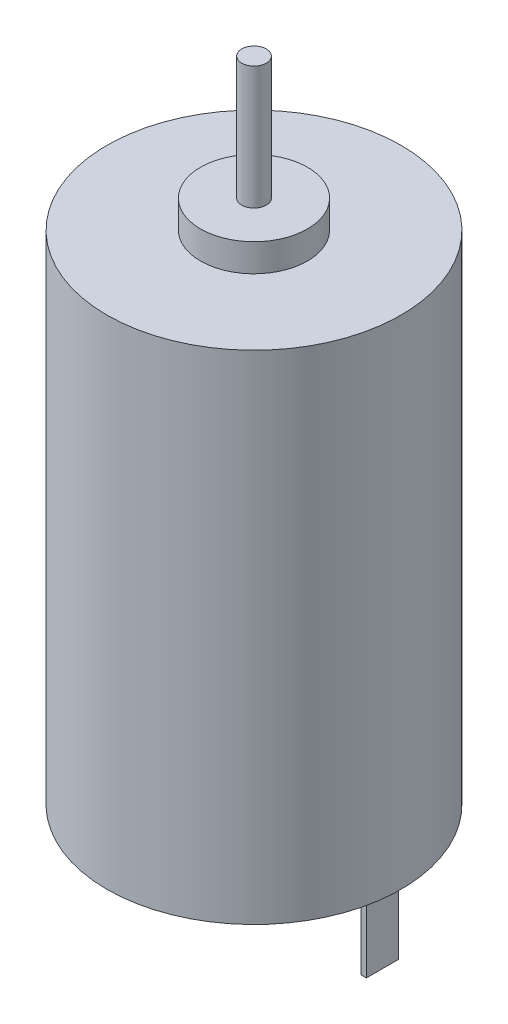
ISO-10303-21;
HEADER;
FILE_DESCRIPTION(('STEP AP214'),'2;1');
FILE_NAME('part.step','',(''),(''),'','','');
FILE_SCHEMA(('AUTOMOTIVE_DESIGN { 1 0 10303 214 1 1 1 1 }'));
ENDSEC;
DATA;
#1=APPLICATION_CONTEXT('core data for automotive mechanical design processes');
#2=APPLICATION_PROTOCOL_DEFINITION('international standard','automotive_design',2000,#1);
#3=PRODUCT_CONTEXT('',#1,'mechanical');
#4=PRODUCT('Part','Part','',(#3));
#5=PRODUCT_RELATED_PRODUCT_CATEGORY('part','',(#4));
#6=PRODUCT_DEFINITION_FORMATION('','',#4);
#7=PRODUCT_DEFINITION_CONTEXT('part definition',#1,'design');
#8=PRODUCT_DEFINITION('design','',#6,#7);
#9=PRODUCT_DEFINITION_SHAPE('','',#8);
#10=(LENGTH_UNIT() NAMED_UNIT(*) SI_UNIT(.MILLI.,.METRE.));
#11=(NAMED_UNIT(*) PLANE_ANGLE_UNIT() SI_UNIT($,.RADIAN.));
#12=(NAMED_UNIT(*) SI_UNIT($,.STERADIAN.) SOLID_ANGLE_UNIT());
#13=UNCERTAINTY_MEASURE_WITH_UNIT(LENGTH_MEASURE(1.E-05),#10,'distance_accuracy_value','');
#14=(GEOMETRIC_REPRESENTATION_CONTEXT(3) GLOBAL_UNCERTAINTY_ASSIGNED_CONTEXT((#13)) GLOBAL_UNIT_ASSIGNED_CONTEXT((#10,
#11,#12)) REPRESENTATION_CONTEXT('',''));
#15=CARTESIAN_POINT('',(0.,0.,0.));
#16=DIRECTION('',(0.,0.,1.));
#17=DIRECTION('',(1.,0.,0.));
#18=AXIS2_PLACEMENT_3D('',#15,#16,#17);
#19=CARTESIAN_POINT('',(0.,60.6,0.));
#20=DIRECTION('',(0.,-1.,0.));
#21=DIRECTION('',(0.,0.,-1.));
#22=AXIS2_PLACEMENT_3D('',#19,#20,#21);
#23=CYLINDRICAL_SURFACE('',#22,1.15);
#24=CARTESIAN_POINT('',(0.,60.6,0.));
#25=DIRECTION('',(0.,1.,0.));
#26=DIRECTION('',(0.,0.,1.));
#27=AXIS2_PLACEMENT_3D('',#24,#25,#26);
#28=CIRCLE('',#27,1.15);
#29=CARTESIAN_POINT('',(0.,60.6,1.15));
#30=VERTEX_POINT('',#29);
#31=EDGE_CURVE('E11',#30,#30,#28,.T.);
#32=ORIENTED_EDGE('',*,*,#31,.F.);
#33=EDGE_LOOP('',(#32));
#34=FACE_BOUND('',#33,.T.);
#35=CARTESIAN_POINT('',(0.,49.1,0.));
#36=DIRECTION('',(0.,1.,0.));
#37=DIRECTION('',(0.,0.,1.));
#38=AXIS2_PLACEMENT_3D('',#35,#36,#37);
#39=CIRCLE('',#38,1.15);
#40=CARTESIAN_POINT('',(0.,49.1,1.15));
#41=VERTEX_POINT('',#40);
#42=EDGE_CURVE('E53',#41,#41,#39,.T.);
#43=ORIENTED_EDGE('',*,*,#42,.T.);
#44=EDGE_LOOP('',(#43));
#45=FACE_BOUND('',#44,.T.);
#46=ADVANCED_FACE('F50',(#34,#45),#23,.T.);
#47=CARTESIAN_POINT('',(0.,60.6,0.));
#48=DIRECTION('',(0.,1.,0.));
#49=DIRECTION('',(0.,0.,1.));
#50=AXIS2_PLACEMENT_3D('',#47,#48,#49);
#51=PLANE('',#50);
#52=ORIENTED_EDGE('',*,*,#31,.T.);
#53=EDGE_LOOP('',(#52));
#54=FACE_BOUND('',#53,.T.);
#55=ADVANCED_FACE('F65',(#54),#51,.T.);
#56=CARTESIAN_POINT('',(0.,49.1,0.));
#57=DIRECTION('',(0.,1.,0.));
#58=DIRECTION('',(0.,0.,1.));
#59=AXIS2_PLACEMENT_3D('',#56,#57,#58);
#60=PLANE('',#59);
#61=ORIENTED_EDGE('',*,*,#42,.F.);
#62=EDGE_LOOP('',(#61));
#63=FACE_BOUND('',#62,.T.);
#64=ADVANCED_FACE('F63',(#63),#60,.F.);
#65=CLOSED_SHELL('',(#46,#55,#64));
#66=MANIFOLD_SOLID_BREP('B2',#65);
#67=CARTESIAN_POINT('',(12.,-7.3,1.5));
#68=DIRECTION('',(-1.,0.,0.));
#69=DIRECTION('',(0.,0.,1.));
#70=AXIS2_PLACEMENT_3D('',#67,#68,#69);
#71=PLANE('',#70);
#72=DIRECTION('',(0.,0.,1.));
#73=VECTOR('',#72,1.);
#74=CARTESIAN_POINT('',(12.,0.,1.5));
#75=LINE('',#74,#73);
#76=CARTESIAN_POINT('',(12.,0.,-1.5));
#77=VERTEX_POINT('',#76);
#78=CARTESIAN_POINT('',(12.,0.,1.5));
#79=VERTEX_POINT('',#78);
#80=EDGE_CURVE('E164',#77,#79,#75,.T.);
#81=ORIENTED_EDGE('',*,*,#80,.T.);
#82=DIRECTION('',(0.,1.,0.));
#83=VECTOR('',#82,1.);
#84=CARTESIAN_POINT('',(12.,-7.3,1.5));
#85=LINE('',#84,#83);
#86=CARTESIAN_POINT('',(12.,-7.3,1.5));
#87=VERTEX_POINT('',#86);
#88=EDGE_CURVE('E48',#87,#79,#85,.T.);
#89=ORIENTED_EDGE('',*,*,#88,.F.);
#90=DIRECTION('',(0.,0.,1.));
#91=VECTOR('',#90,1.);
#92=CARTESIAN_POINT('',(12.,-7.3,1.5));
#93=LINE('',#92,#91);
#94=CARTESIAN_POINT('',(12.,-7.3,-1.5));
#95=VERTEX_POINT('',#94);
#96=EDGE_CURVE('E152',#95,#87,#93,.T.);
#97=ORIENTED_EDGE('',*,*,#96,.F.);
#98=DIRECTION('',(0.,1.,0.));
#99=VECTOR('',#98,1.);
#100=CARTESIAN_POINT('',(12.,-7.3,-1.5));
#101=LINE('',#100,#99);
#102=EDGE_CURVE('E160',#95,#77,#101,.T.);
#103=ORIENTED_EDGE('',*,*,#102,.T.);
#104=EDGE_LOOP('',(#81,#89,#97,#103));
#105=FACE_BOUND('',#104,.T.);
#106=ADVANCED_FACE('F101',(#105),#71,.F.);
#107=CARTESIAN_POINT('',(12.,-7.3,1.5));
#108=DIRECTION('',(0.,0.,-1.));
#109=DIRECTION('',(-1.,0.,0.));
#110=AXIS2_PLACEMENT_3D('',#107,#108,#109);
#111=PLANE('',#110);
#112=DIRECTION('',(-1.,0.,0.));
#113=VECTOR('',#112,1.);
#114=CARTESIAN_POINT('',(12.,0.,1.5));
#115=LINE('',#114,#113);
#116=CARTESIAN_POINT('',(11.5,0.,1.5));
#117=VERTEX_POINT('',#116);
#118=EDGE_CURVE('E156',#79,#117,#115,.T.);
#119=ORIENTED_EDGE('',*,*,#118,.T.);
#120=DIRECTION('',(0.,1.,0.));
#121=VECTOR('',#120,1.);
#122=CARTESIAN_POINT('',(11.5,-7.3,1.5));
#123=LINE('',#122,#121);
#124=CARTESIAN_POINT('',(11.5,-7.3,1.5));
#125=VERTEX_POINT('',#124);
#126=EDGE_CURVE('E109',#125,#117,#123,.T.);
#127=ORIENTED_EDGE('',*,*,#126,.F.);
#128=DIRECTION('',(-1.,0.,0.));
#129=VECTOR('',#128,1.);
#130=CARTESIAN_POINT('',(12.,-7.3,1.5));
#131=LINE('',#130,#129);
#132=EDGE_CURVE('E147',#87,#125,#131,.T.);
#133=ORIENTED_EDGE('',*,*,#132,.F.);
#134=ORIENTED_EDGE('',*,*,#88,.T.);
#135=EDGE_LOOP('',(#119,#127,#133,#134));
#136=FACE_BOUND('',#135,.T.);
#137=ADVANCED_FACE('F155',(#136),#111,.F.);
#138=CARTESIAN_POINT('',(11.5,-7.3,1.5));
#139=DIRECTION('',(1.,0.,0.));
#140=DIRECTION('',(0.,0.,-1.));
#141=AXIS2_PLACEMENT_3D('',#138,#139,#140);
#142=PLANE('',#141);
#143=DIRECTION('',(0.,0.,-1.));
#144=VECTOR('',#143,1.);
#145=CARTESIAN_POINT('',(11.5,0.,1.5));
#146=LINE('',#145,#144);
#147=CARTESIAN_POINT('',(11.5,0.,-1.5));
#148=VERTEX_POINT('',#147);
#149=EDGE_CURVE('E134',#117,#148,#146,.T.);
#150=ORIENTED_EDGE('',*,*,#149,.T.);
#151=DIRECTION('',(0.,1.,0.));
#152=VECTOR('',#151,1.);
#153=CARTESIAN_POINT('',(11.5,-7.3,-1.5));
#154=LINE('',#153,#152);
#155=CARTESIAN_POINT('',(11.5,-7.3,-1.5));
#156=VERTEX_POINT('',#155);
#157=EDGE_CURVE('E157',#156,#148,#154,.T.);
#158=ORIENTED_EDGE('',*,*,#157,.F.);
#159=DIRECTION('',(0.,0.,-1.));
#160=VECTOR('',#159,1.);
#161=CARTESIAN_POINT('',(11.5,-7.3,1.5));
#162=LINE('',#161,#160);
#163=EDGE_CURVE('E150',#125,#156,#162,.T.);
#164=ORIENTED_EDGE('',*,*,#163,.F.);
#165=ORIENTED_EDGE('',*,*,#126,.T.);
#166=EDGE_LOOP('',(#150,#158,#164,#165));
#167=FACE_BOUND('',#166,.T.);
#168=ADVANCED_FACE('F158',(#167),#142,.F.);
#169=CARTESIAN_POINT('',(12.,-7.3,-1.5));
#170=DIRECTION('',(0.,0.,1.));
#171=DIRECTION('',(1.,0.,0.));
#172=AXIS2_PLACEMENT_3D('',#169,#170,#171);
#173=PLANE('',#172);
#174=DIRECTION('',(1.,0.,0.));
#175=VECTOR('',#174,1.);
#176=CARTESIAN_POINT('',(12.,0.,-1.5));
#177=LINE('',#176,#175);
#178=EDGE_CURVE('E140',#148,#77,#177,.T.);
#179=ORIENTED_EDGE('',*,*,#178,.T.);
#180=ORIENTED_EDGE('',*,*,#102,.F.);
#181=DIRECTION('',(1.,0.,0.));
#182=VECTOR('',#181,1.);
#183=CARTESIAN_POINT('',(12.,-7.3,-1.5));
#184=LINE('',#183,#182);
#185=EDGE_CURVE('E117',#156,#95,#184,.T.);
#186=ORIENTED_EDGE('',*,*,#185,.F.);
#187=ORIENTED_EDGE('',*,*,#157,.T.);
#188=EDGE_LOOP('',(#179,#180,#186,#187));
#189=FACE_BOUND('',#188,.T.);
#190=ADVANCED_FACE('F171',(#189),#173,.F.);
#191=CARTESIAN_POINT('',(0.,-7.3,0.));
#192=DIRECTION('',(0.,1.,0.));
#193=DIRECTION('',(0.,0.,1.));
#194=AXIS2_PLACEMENT_3D('',#191,#192,#193);
#195=PLANE('',#194);
#196=ORIENTED_EDGE('',*,*,#96,.T.);
#197=ORIENTED_EDGE('',*,*,#132,.T.);
#198=ORIENTED_EDGE('',*,*,#163,.T.);
#199=ORIENTED_EDGE('',*,*,#185,.T.);
#200=EDGE_LOOP('',(#196,#197,#198,#199));
#201=FACE_BOUND('',#200,.T.);
#202=ADVANCED_FACE('F148',(#201),#195,.F.);
#203=CARTESIAN_POINT('',(0.,0.,0.));
#204=DIRECTION('',(0.,1.,0.));
#205=DIRECTION('',(0.,0.,1.));
#206=AXIS2_PLACEMENT_3D('',#203,#204,#205);
#207=PLANE('',#206);
#208=ORIENTED_EDGE('',*,*,#80,.F.);
#209=ORIENTED_EDGE('',*,*,#178,.F.);
#210=ORIENTED_EDGE('',*,*,#149,.F.);
#211=ORIENTED_EDGE('',*,*,#118,.F.);
#212=EDGE_LOOP('',(#208,#209,#210,#211));
#213=FACE_BOUND('',#212,.T.);
#214=ADVANCED_FACE('F174',(#213),#207,.T.);
#215=CLOSED_SHELL('',(#106,#137,#168,#190,#202,#214));
#216=MANIFOLD_SOLID_BREP('B6',#215);
#217=CARTESIAN_POINT('',(-12.,-7.3,1.5));
#218=DIRECTION('',(1.,0.,0.));
#219=DIRECTION('',(0.,0.,-1.));
#220=AXIS2_PLACEMENT_3D('',#217,#218,#219);
#221=PLANE('',#220);
#222=DIRECTION('',(0.,0.,-1.));
#223=VECTOR('',#222,1.);
#224=CARTESIAN_POINT('',(-12.,0.,1.5));
#225=LINE('',#224,#223);
#226=CARTESIAN_POINT('',(-12.,0.,1.5));
#227=VERTEX_POINT('',#226);
#228=CARTESIAN_POINT('',(-12.,0.,-1.5));
#229=VERTEX_POINT('',#228);
#230=EDGE_CURVE('E295',#227,#229,#225,.T.);
#231=ORIENTED_EDGE('',*,*,#230,.T.);
#232=DIRECTION('',(0.,1.,0.));
#233=VECTOR('',#232,1.);
#234=CARTESIAN_POINT('',(-12.,-7.3,-1.5));
#235=LINE('',#234,#233);
#236=CARTESIAN_POINT('',(-12.,-7.3,-1.5));
#237=VERTEX_POINT('',#236);
#238=EDGE_CURVE('E99',#237,#229,#235,.T.);
#239=ORIENTED_EDGE('',*,*,#238,.F.);
#240=DIRECTION('',(0.,0.,-1.));
#241=VECTOR('',#240,1.);
#242=CARTESIAN_POINT('',(-12.,-7.3,1.5));
#243=LINE('',#242,#241);
#244=CARTESIAN_POINT('',(-12.,-7.3,1.5));
#245=VERTEX_POINT('',#244);
#246=EDGE_CURVE('E283',#245,#237,#243,.T.);
#247=ORIENTED_EDGE('',*,*,#246,.F.);
#248=DIRECTION('',(0.,1.,0.));
#249=VECTOR('',#248,1.);
#250=CARTESIAN_POINT('',(-12.,-7.3,1.5));
#251=LINE('',#250,#249);
#252=EDGE_CURVE('E291',#245,#227,#251,.T.);
#253=ORIENTED_EDGE('',*,*,#252,.T.);
#254=EDGE_LOOP('',(#231,#239,#247,#253));
#255=FACE_BOUND('',#254,.T.);
#256=ADVANCED_FACE('F232',(#255),#221,.F.);
#257=CARTESIAN_POINT('',(-12.,-7.3,-1.5));
#258=DIRECTION('',(0.,0.,1.));
#259=DIRECTION('',(1.,0.,0.));
#260=AXIS2_PLACEMENT_3D('',#257,#258,#259);
#261=PLANE('',#260);
#262=DIRECTION('',(1.,0.,0.));
#263=VECTOR('',#262,1.);
#264=CARTESIAN_POINT('',(-12.,0.,-1.5));
#265=LINE('',#264,#263);
#266=CARTESIAN_POINT('',(-11.5,0.,-1.5));
#267=VERTEX_POINT('',#266);
#268=EDGE_CURVE('E287',#229,#267,#265,.T.);
#269=ORIENTED_EDGE('',*,*,#268,.T.);
#270=DIRECTION('',(0.,1.,0.));
#271=VECTOR('',#270,1.);
#272=CARTESIAN_POINT('',(-11.5,-7.3,-1.5));
#273=LINE('',#272,#271);
#274=CARTESIAN_POINT('',(-11.5,-7.3,-1.5));
#275=VERTEX_POINT('',#274);
#276=EDGE_CURVE('E240',#275,#267,#273,.T.);
#277=ORIENTED_EDGE('',*,*,#276,.F.);
#278=DIRECTION('',(1.,0.,0.));
#279=VECTOR('',#278,1.);
#280=CARTESIAN_POINT('',(-12.,-7.3,-1.5));
#281=LINE('',#280,#279);
#282=EDGE_CURVE('E278',#237,#275,#281,.T.);
#283=ORIENTED_EDGE('',*,*,#282,.F.);
#284=ORIENTED_EDGE('',*,*,#238,.T.);
#285=EDGE_LOOP('',(#269,#277,#283,#284));
#286=FACE_BOUND('',#285,.T.);
#287=ADVANCED_FACE('F286',(#286),#261,.F.);
#288=CARTESIAN_POINT('',(-11.5,-7.3,1.5));
#289=DIRECTION('',(-1.,0.,0.));
#290=DIRECTION('',(0.,0.,1.));
#291=AXIS2_PLACEMENT_3D('',#288,#289,#290);
#292=PLANE('',#291);
#293=DIRECTION('',(0.,0.,1.));
#294=VECTOR('',#293,1.);
#295=CARTESIAN_POINT('',(-11.5,0.,1.5));
#296=LINE('',#295,#294);
#297=CARTESIAN_POINT('',(-11.5,0.,1.5));
#298=VERTEX_POINT('',#297);
#299=EDGE_CURVE('E265',#267,#298,#296,.T.);
#300=ORIENTED_EDGE('',*,*,#299,.T.);
#301=DIRECTION('',(0.,1.,0.));
#302=VECTOR('',#301,1.);
#303=CARTESIAN_POINT('',(-11.5,-7.3,1.5));
#304=LINE('',#303,#302);
#305=CARTESIAN_POINT('',(-11.5,-7.3,1.5));
#306=VERTEX_POINT('',#305);
#307=EDGE_CURVE('E288',#306,#298,#304,.T.);
#308=ORIENTED_EDGE('',*,*,#307,.F.);
#309=DIRECTION('',(0.,0.,1.));
#310=VECTOR('',#309,1.);
#311=CARTESIAN_POINT('',(-11.5,-7.3,1.5));
#312=LINE('',#311,#310);
#313=EDGE_CURVE('E281',#275,#306,#312,.T.);
#314=ORIENTED_EDGE('',*,*,#313,.F.);
#315=ORIENTED_EDGE('',*,*,#276,.T.);
#316=EDGE_LOOP('',(#300,#308,#314,#315));
#317=FACE_BOUND('',#316,.T.);
#318=ADVANCED_FACE('F289',(#317),#292,.F.);
#319=CARTESIAN_POINT('',(-12.,-7.3,1.5));
#320=DIRECTION('',(0.,0.,-1.));
#321=DIRECTION('',(-1.,0.,0.));
#322=AXIS2_PLACEMENT_3D('',#319,#320,#321);
#323=PLANE('',#322);
#324=DIRECTION('',(-1.,0.,0.));
#325=VECTOR('',#324,1.);
#326=CARTESIAN_POINT('',(-12.,0.,1.5));
#327=LINE('',#326,#325);
#328=EDGE_CURVE('E271',#298,#227,#327,.T.);
#329=ORIENTED_EDGE('',*,*,#328,.T.);
#330=ORIENTED_EDGE('',*,*,#252,.F.);
#331=DIRECTION('',(-1.,0.,0.));
#332=VECTOR('',#331,1.);
#333=CARTESIAN_POINT('',(-12.,-7.3,1.5));
#334=LINE('',#333,#332);
#335=EDGE_CURVE('E248',#306,#245,#334,.T.);
#336=ORIENTED_EDGE('',*,*,#335,.F.);
#337=ORIENTED_EDGE('',*,*,#307,.T.);
#338=EDGE_LOOP('',(#329,#330,#336,#337));
#339=FACE_BOUND('',#338,.T.);
#340=ADVANCED_FACE('F302',(#339),#323,.F.);
#341=CARTESIAN_POINT('',(0.,-7.3,0.));
#342=DIRECTION('',(0.,-1.,0.));
#343=DIRECTION('',(0.,0.,-1.));
#344=AXIS2_PLACEMENT_3D('',#341,#342,#343);
#345=PLANE('',#344);
#346=ORIENTED_EDGE('',*,*,#246,.T.);
#347=ORIENTED_EDGE('',*,*,#282,.T.);
#348=ORIENTED_EDGE('',*,*,#313,.T.);
#349=ORIENTED_EDGE('',*,*,#335,.T.);
#350=EDGE_LOOP('',(#346,#347,#348,#349));
#351=FACE_BOUND('',#350,.T.);
#352=ADVANCED_FACE('F279',(#351),#345,.T.);
#353=CARTESIAN_POINT('',(0.,0.,0.));
#354=DIRECTION('',(0.,-1.,0.));
#355=DIRECTION('',(0.,0.,-1.));
#356=AXIS2_PLACEMENT_3D('',#353,#354,#355);
#357=PLANE('',#356);
#358=ORIENTED_EDGE('',*,*,#230,.F.);
#359=ORIENTED_EDGE('',*,*,#328,.F.);
#360=ORIENTED_EDGE('',*,*,#299,.F.);
#361=ORIENTED_EDGE('',*,*,#268,.F.);
#362=EDGE_LOOP('',(#358,#359,#360,#361));
#363=FACE_BOUND('',#362,.T.);
#364=ADVANCED_FACE('F305',(#363),#357,.F.);
#365=CLOSED_SHELL('',(#256,#287,#318,#340,#352,#364));
#366=MANIFOLD_SOLID_BREP('B42',#365);
#367=CARTESIAN_POINT('',(0.,46.5,0.));
#368=DIRECTION('',(0.,-1.,0.));
#369=DIRECTION('',(0.,0.,-1.));
#370=AXIS2_PLACEMENT_3D('',#367,#368,#369);
#371=CYLINDRICAL_SURFACE('',#370,13.75);
#372=CARTESIAN_POINT('',(0.,46.5,0.));
#373=DIRECTION('',(0.,1.,0.));
#374=DIRECTION('',(0.,0.,1.));
#375=AXIS2_PLACEMENT_3D('',#372,#373,#374);
#376=CIRCLE('',#375,13.75);
#377=CARTESIAN_POINT('',(0.,46.5,-13.75));
#378=VERTEX_POINT('',#377);
#379=EDGE_CURVE('E370',#378,#378,#376,.T.);
#380=CARTESIAN_POINT('',(0.,0.,0.));
#381=DIRECTION('',(0.,1.,0.));
#382=DIRECTION('',(0.,0.,1.));
#383=AXIS2_PLACEMENT_3D('',#380,#381,#382);
#384=CIRCLE('',#383,13.75);
#385=CARTESIAN_POINT('',(0.,0.,-13.75));
#386=VERTEX_POINT('',#385);
#387=EDGE_CURVE('E359',#386,#386,#384,.T.);
#388=CARTESIAN_POINT('',(0.,46.5,-13.75));
#389=CARTESIAN_POINT('',(0.,46.015625,-13.75));
#390=CARTESIAN_POINT('',(0.,45.53125,-13.75));
#391=CARTESIAN_POINT('',(0.,44.5625,-13.75));
#392=CARTESIAN_POINT('',(0.,44.078125,-13.75));
#393=CARTESIAN_POINT('',(0.,43.109375,-13.75));
#394=CARTESIAN_POINT('',(0.,42.625,-13.75));
#395=CARTESIAN_POINT('',(0.,41.65625,-13.75));
#396=CARTESIAN_POINT('',(0.,41.171875,-13.75));
#397=CARTESIAN_POINT('',(0.,40.203125,-13.75));
#398=CARTESIAN_POINT('',(0.,39.71875,-13.75));
#399=CARTESIAN_POINT('',(0.,38.75,-13.75));
#400=CARTESIAN_POINT('',(0.,38.265625,-13.75));
#401=CARTESIAN_POINT('',(0.,37.296875,-13.75));
#402=CARTESIAN_POINT('',(0.,36.8125,-13.75));
#403=CARTESIAN_POINT('',(0.,35.84375,-13.75));
#404=CARTESIAN_POINT('',(0.,35.359375,-13.75));
#405=CARTESIAN_POINT('',(0.,34.390625,-13.75));
#406=CARTESIAN_POINT('',(0.,33.90625,-13.75));
#407=CARTESIAN_POINT('',(0.,32.9375,-13.75));
#408=CARTESIAN_POINT('',(0.,32.453125,-13.75));
#409=CARTESIAN_POINT('',(0.,31.484375,-13.75));
#410=CARTESIAN_POINT('',(0.,31.,-13.75));
#411=CARTESIAN_POINT('',(0.,30.03125,-13.75));
#412=CARTESIAN_POINT('',(0.,29.546875,-13.75));
#413=CARTESIAN_POINT('',(0.,28.578125,-13.75));
#414=CARTESIAN_POINT('',(0.,28.09375,-13.75));
#415=CARTESIAN_POINT('',(0.,27.125,-13.75));
#416=CARTESIAN_POINT('',(0.,26.640625,-13.75));
#417=CARTESIAN_POINT('',(0.,25.671875,-13.75));
#418=CARTESIAN_POINT('',(0.,25.1875,-13.75));
#419=CARTESIAN_POINT('',(0.,24.21875,-13.75));
#420=CARTESIAN_POINT('',(0.,23.734375,-13.75));
#421=CARTESIAN_POINT('',(0.,22.765625,-13.75));
#422=CARTESIAN_POINT('',(0.,22.28125,-13.75));
#423=CARTESIAN_POINT('',(0.,21.3125,-13.75));
#424=CARTESIAN_POINT('',(0.,20.828125,-13.75));
#425=CARTESIAN_POINT('',(0.,19.859375,-13.75));
#426=CARTESIAN_POINT('',(0.,19.375,-13.75));
#427=CARTESIAN_POINT('',(0.,18.40625,-13.75));
#428=CARTESIAN_POINT('',(0.,17.921875,-13.75));
#429=CARTESIAN_POINT('',(0.,16.953125,-13.75));
#430=CARTESIAN_POINT('',(0.,16.46875,-13.75));
#431=CARTESIAN_POINT('',(0.,15.5,-13.75));
#432=CARTESIAN_POINT('',(0.,15.015625,-13.75));
#433=CARTESIAN_POINT('',(0.,14.046875,-13.75));
#434=CARTESIAN_POINT('',(0.,13.5625,-13.75));
#435=CARTESIAN_POINT('',(0.,12.59375,-13.75));
#436=CARTESIAN_POINT('',(0.,12.109375,-13.75));
#437=CARTESIAN_POINT('',(0.,11.140625,-13.75));
#438=CARTESIAN_POINT('',(0.,10.65625,-13.75));
#439=CARTESIAN_POINT('',(0.,9.6875,-13.75));
#440=CARTESIAN_POINT('',(0.,9.203125,-13.75));
#441=CARTESIAN_POINT('',(0.,8.23437499999999,-13.75));
#442=CARTESIAN_POINT('',(0.,7.74999999999999,-13.75));
#443=CARTESIAN_POINT('',(0.,6.78124999999999,-13.75));
#444=CARTESIAN_POINT('',(0.,6.29687499999999,-13.75));
#445=CARTESIAN_POINT('',(0.,5.32812499999999,-13.75));
#446=CARTESIAN_POINT('',(0.,4.84374999999999,-13.75));
#447=CARTESIAN_POINT('',(0.,3.87499999999999,-13.75));
#448=CARTESIAN_POINT('',(0.,3.39062499999999,-13.75));
#449=CARTESIAN_POINT('',(0.,2.42187499999999,-13.75));
#450=CARTESIAN_POINT('',(0.,1.93749999999999,-13.75));
#451=CARTESIAN_POINT('',(0.,0.968749999999993,-13.75));
#452=CARTESIAN_POINT('',(0.,0.484374999999993,-13.75));
#453=CARTESIAN_POINT('',(0.,0.,-13.75));
#454=B_SPLINE_CURVE_WITH_KNOTS('',3,(#388,#389,#390,#391,#392,#393,#394,#395,#396,#397,#398,
#399,#400,#401,#402,#403,#404,#405,#406,#407,#408,#409,#410,#411,#412,#413,#414,#415,#416,#417,
#418,#419,#420,#421,#422,#423,#424,#425,#426,#427,#428,#429,#430,#431,#432,#433,#434,#435,#436,
#437,#438,#439,#440,#441,#442,#443,#444,#445,#446,#447,#448,#449,#450,#451,#452,#453),
.UNSPECIFIED.,.F.,.F.,(4,2,2,2,2,2,2,2,2,2,2,2,2,2,2,2,2,2,2,2,2,2,2,2,2,2,2,2,2,2,2,2,4),(0.,
1.453125,2.90625,4.359375,5.8125,7.265625,8.71875,10.171875,11.625,13.078125,14.53125,15.984375,
17.4375,18.890625,20.34375,21.796875,23.25,24.703125,26.15625,27.609375,29.0625,30.515625,
31.96875,33.421875,34.875,36.328125,37.78125,39.234375,40.6875,42.140625,43.59375,45.046875,
46.5),.UNSPECIFIED.);
#455=EDGE_CURVE('BSEAM356',#378,#386,#454,.T.);
#456=ORIENTED_EDGE('',*,*,#379,.F.);
#457=ORIENTED_EDGE('',*,*,#387,.T.);
#458=ORIENTED_EDGE('',*,*,#455,.T.);
#459=ORIENTED_EDGE('',*,*,#455,.F.);
#460=EDGE_LOOP('',(#456,#458,#457,#459));
#461=FACE_BOUND('',#460,.T.);
#462=ADVANCED_FACE('F356',(#461),#371,.T.);
#463=CARTESIAN_POINT('',(0.,46.5,0.));
#464=DIRECTION('',(0.,1.,0.));
#465=DIRECTION('',(0.,0.,1.));
#466=AXIS2_PLACEMENT_3D('',#463,#464,#465);
#467=PLANE('',#466);
#468=CARTESIAN_POINT('',(0.,46.5,0.));
#469=DIRECTION('',(0.,1.,0.));
#470=DIRECTION('',(0.,0.,1.));
#471=AXIS2_PLACEMENT_3D('',#468,#469,#470);
#472=CIRCLE('',#471,5.);
#473=CARTESIAN_POINT('',(0.,46.5,5.));
#474=VERTEX_POINT('',#473);
#475=EDGE_CURVE('E231',#474,#474,#472,.T.);
#476=ORIENTED_EDGE('',*,*,#475,.F.);
#477=EDGE_LOOP('',(#476));
#478=FACE_BOUND('',#477,.T.);
#479=ORIENTED_EDGE('',*,*,#379,.T.);
#480=EDGE_LOOP('',(#479));
#481=FACE_BOUND('',#480,.T.);
#482=ADVANCED_FACE('F390',(#478,#481),#467,.T.);
#483=CARTESIAN_POINT('',(0.,0.,0.));
#484=DIRECTION('',(0.,1.,0.));
#485=DIRECTION('',(0.,0.,1.));
#486=AXIS2_PLACEMENT_3D('',#483,#484,#485);
#487=PLANE('',#486);
#488=CARTESIAN_POINT('',(0.,0.,0.));
#489=DIRECTION('',(0.,-1.,0.));
#490=DIRECTION('',(0.,0.,-1.));
#491=AXIS2_PLACEMENT_3D('',#488,#489,#490);
#492=CIRCLE('',#491,5.);
#493=CARTESIAN_POINT('',(0.,0.,-5.));
#494=VERTEX_POINT('',#493);
#495=EDGE_CURVE('E364',#494,#494,#492,.T.);
#496=ORIENTED_EDGE('',*,*,#495,.F.);
#497=EDGE_LOOP('',(#496));
#498=FACE_BOUND('',#497,.T.);
#499=ORIENTED_EDGE('',*,*,#387,.F.);
#500=EDGE_LOOP('',(#499));
#501=FACE_BOUND('',#500,.T.);
#502=ADVANCED_FACE('F387',(#498,#501),#487,.F.);
#503=CARTESIAN_POINT('',(0.,-2.6,0.));
#504=DIRECTION('',(0.,1.,0.));
#505=DIRECTION('',(0.,0.,1.));
#506=AXIS2_PLACEMENT_3D('',#503,#504,#505);
#507=CYLINDRICAL_SURFACE('',#506,5.);
#508=CARTESIAN_POINT('',(0.,-2.6,0.));
#509=DIRECTION('',(0.,-1.,0.));
#510=DIRECTION('',(0.,0.,-1.));
#511=AXIS2_PLACEMENT_3D('',#508,#509,#510);
#512=CIRCLE('',#511,5.);
#513=CARTESIAN_POINT('',(0.,-2.6,-5.));
#514=VERTEX_POINT('',#513);
#515=EDGE_CURVE('E375',#514,#514,#512,.T.);
#516=ORIENTED_EDGE('',*,*,#515,.F.);
#517=EDGE_LOOP('',(#516));
#518=FACE_BOUND('',#517,.T.);
#519=ORIENTED_EDGE('',*,*,#495,.T.);
#520=EDGE_LOOP('',(#519));
#521=FACE_BOUND('',#520,.T.);
#522=ADVANCED_FACE('F389',(#518,#521),#507,.T.);
#523=CARTESIAN_POINT('',(0.,-2.6,0.));
#524=DIRECTION('',(0.,-1.,0.));
#525=DIRECTION('',(0.,0.,-1.));
#526=AXIS2_PLACEMENT_3D('',#523,#524,#525);
#527=PLANE('',#526);
#528=ORIENTED_EDGE('',*,*,#515,.T.);
#529=EDGE_LOOP('',(#528));
#530=FACE_BOUND('',#529,.T.);
#531=ADVANCED_FACE('F396',(#530),#527,.T.);
#532=CARTESIAN_POINT('',(0.,49.1,0.));
#533=DIRECTION('',(0.,-1.,0.));
#534=DIRECTION('',(0.,0.,-1.));
#535=AXIS2_PLACEMENT_3D('',#532,#533,#534);
#536=CYLINDRICAL_SURFACE('',#535,5.);
#537=CARTESIAN_POINT('',(0.,49.1,0.));
#538=DIRECTION('',(0.,1.,0.));
#539=DIRECTION('',(0.,0.,1.));
#540=AXIS2_PLACEMENT_3D('',#537,#538,#539);
#541=CIRCLE('',#540,5.);
#542=CARTESIAN_POINT('',(0.,49.1,5.));
#543=VERTEX_POINT('',#542);
#544=EDGE_CURVE('E374',#543,#543,#541,.T.);
#545=ORIENTED_EDGE('',*,*,#544,.F.);
#546=EDGE_LOOP('',(#545));
#547=FACE_BOUND('',#546,.T.);
#548=ORIENTED_EDGE('',*,*,#475,.T.);
#549=EDGE_LOOP('',(#548));
#550=FACE_BOUND('',#549,.T.);
#551=ADVANCED_FACE('F421',(#547,#550),#536,.T.);
#552=CARTESIAN_POINT('',(0.,49.1,0.));
#553=DIRECTION('',(0.,1.,0.));
#554=DIRECTION('',(0.,0.,1.));
#555=AXIS2_PLACEMENT_3D('',#552,#553,#554);
#556=PLANE('',#555);
#557=ORIENTED_EDGE('',*,*,#544,.T.);
#558=EDGE_LOOP('',(#557));
#559=FACE_BOUND('',#558,.T.);
#560=ADVANCED_FACE('F426',(#559),#556,.T.);
#561=CLOSED_SHELL('',(#462,#482,#502,#522,#531,#551,#560));
#562=MANIFOLD_SOLID_BREP('B93',#561);
#563=ADVANCED_BREP_SHAPE_REPRESENTATION('',(#18,#66,#216,#366,#562),#14);
#564=SHAPE_DEFINITION_REPRESENTATION(#9,#563);
ENDSEC;
END-ISO-10303-21;
